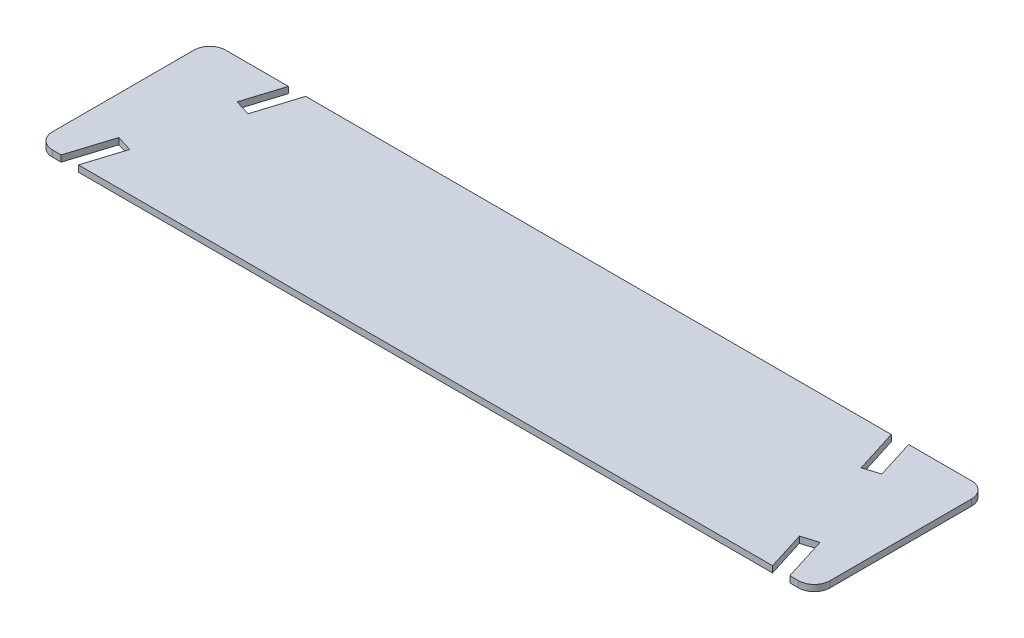
ISO-10303-21;
HEADER;
FILE_DESCRIPTION(('STEP AP214'),'2;1');
FILE_NAME('part.step','',(''),(''),'','','');
FILE_SCHEMA(('AUTOMOTIVE_DESIGN { 1 0 10303 214 1 1 1 1 }'));
ENDSEC;
DATA;
#1=APPLICATION_CONTEXT('core data for automotive mechanical design processes');
#2=APPLICATION_PROTOCOL_DEFINITION('international standard','automotive_design',2000,#1);
#3=PRODUCT_CONTEXT('',#1,'mechanical');
#4=PRODUCT('Part','Part','',(#3));
#5=PRODUCT_RELATED_PRODUCT_CATEGORY('part','',(#4));
#6=PRODUCT_DEFINITION_FORMATION('','',#4);
#7=PRODUCT_DEFINITION_CONTEXT('part definition',#1,'design');
#8=PRODUCT_DEFINITION('design','',#6,#7);
#9=PRODUCT_DEFINITION_SHAPE('','',#8);
#10=(LENGTH_UNIT() NAMED_UNIT(*) SI_UNIT(.MILLI.,.METRE.));
#11=(NAMED_UNIT(*) PLANE_ANGLE_UNIT() SI_UNIT($,.RADIAN.));
#12=(NAMED_UNIT(*) SI_UNIT($,.STERADIAN.) SOLID_ANGLE_UNIT());
#13=UNCERTAINTY_MEASURE_WITH_UNIT(LENGTH_MEASURE(1.E-05),#10,'distance_accuracy_value','');
#14=(GEOMETRIC_REPRESENTATION_CONTEXT(3) GLOBAL_UNCERTAINTY_ASSIGNED_CONTEXT((#13)) GLOBAL_UNIT_ASSIGNED_CONTEXT((#10,
#11,#12)) REPRESENTATION_CONTEXT('',''));
#15=CARTESIAN_POINT('',(0.,0.,0.));
#16=DIRECTION('',(0.,0.,1.));
#17=DIRECTION('',(1.,0.,0.));
#18=AXIS2_PLACEMENT_3D('',#15,#16,#17);
#19=CARTESIAN_POINT('',(233.90979776498,2.,0.));
#20=DIRECTION('',(-0.954146487599236,0.,0.299340074500628));
#21=DIRECTION('',(0.299340074500628,0.,0.954146487599236));
#22=AXIS2_PLACEMENT_3D('',#19,#20,#21);
#23=PLANE('',#22);
#24=DIRECTION('',(-0.299340074500628,0.,-0.954146487599236));
#25=VECTOR('',#24,1.);
#26=CARTESIAN_POINT('',(233.90979776498,0.,0.));
#27=LINE('',#26,#25);
#28=CARTESIAN_POINT('',(233.90979776498,0.,0.));
#29=VERTEX_POINT('',#28);
#30=CARTESIAN_POINT('',(230.018963258697,0.,-12.4020349904474));
#31=VERTEX_POINT('',#30);
#32=EDGE_CURVE('E225',#29,#31,#27,.T.);
#33=ORIENTED_EDGE('',*,*,#32,.T.);
#34=DIRECTION('',(0.,-1.,0.));
#35=VECTOR('',#34,1.);
#36=CARTESIAN_POINT('',(230.018963258697,2.,-12.4020349904474));
#37=LINE('',#36,#35);
#38=CARTESIAN_POINT('',(230.018963258697,2.,-12.4020349904474));
#39=VERTEX_POINT('',#38);
#40=EDGE_CURVE('E11',#39,#31,#37,.T.);
#41=ORIENTED_EDGE('',*,*,#40,.F.);
#42=DIRECTION('',(-0.299340074500628,0.,-0.954146487599236));
#43=VECTOR('',#42,1.);
#44=CARTESIAN_POINT('',(233.90979776498,2.,0.));
#45=LINE('',#44,#43);
#46=CARTESIAN_POINT('',(233.90979776498,2.,0.));
#47=VERTEX_POINT('',#46);
#48=EDGE_CURVE('E271',#47,#39,#45,.T.);
#49=ORIENTED_EDGE('',*,*,#48,.F.);
#50=DIRECTION('',(0.,-1.,0.));
#51=VECTOR('',#50,1.);
#52=CARTESIAN_POINT('',(233.90979776498,2.,0.));
#53=LINE('',#52,#51);
#54=EDGE_CURVE('E221',#47,#29,#53,.T.);
#55=ORIENTED_EDGE('',*,*,#54,.T.);
#56=EDGE_LOOP('',(#33,#41,#49,#55));
#57=FACE_BOUND('',#56,.T.);
#58=ADVANCED_FACE('F33',(#57),#23,.F.);
#59=CARTESIAN_POINT('',(230.018963258697,2.,-12.4020349904474));
#60=DIRECTION('',(-0.299340074500642,0.,-0.954146487599231));
#61=DIRECTION('',(-0.954146487599231,0.,0.299340074500642));
#62=AXIS2_PLACEMENT_3D('',#59,#60,#61);
#63=PLANE('',#62);
#64=DIRECTION('',(0.954146487599231,0.,-0.299340074500642));
#65=VECTOR('',#64,1.);
#66=CARTESIAN_POINT('',(230.018963258697,0.,-12.4020349904474));
#67=LINE('',#66,#65);
#68=CARTESIAN_POINT('',(235.028232318593,0.,-13.9735703815757));
#69=VERTEX_POINT('',#68);
#70=EDGE_CURVE('E228',#31,#69,#67,.T.);
#71=ORIENTED_EDGE('',*,*,#70,.T.);
#72=DIRECTION('',(0.,-1.,0.));
#73=VECTOR('',#72,1.);
#74=CARTESIAN_POINT('',(235.028232318593,2.,-13.9735703815757));
#75=LINE('',#74,#73);
#76=CARTESIAN_POINT('',(235.028232318593,2.,-13.9735703815757));
#77=VERTEX_POINT('',#76);
#78=EDGE_CURVE('E41',#77,#69,#75,.T.);
#79=ORIENTED_EDGE('',*,*,#78,.F.);
#80=DIRECTION('',(0.954146487599231,0.,-0.299340074500642));
#81=VECTOR('',#80,1.);
#82=CARTESIAN_POINT('',(230.018963258697,2.,-12.4020349904474));
#83=LINE('',#82,#81);
#84=EDGE_CURVE('E140',#39,#77,#83,.T.);
#85=ORIENTED_EDGE('',*,*,#84,.F.);
#86=ORIENTED_EDGE('',*,*,#40,.T.);
#87=EDGE_LOOP('',(#71,#79,#85,#86));
#88=FACE_BOUND('',#87,.T.);
#89=ADVANCED_FACE('F409',(#88),#63,.F.);
#90=CARTESIAN_POINT('',(235.028232318593,2.,-13.9735703815757));
#91=DIRECTION('',(0.954146487599231,0.,-0.299340074500643));
#92=DIRECTION('',(-0.299340074500643,0.,-0.954146487599231));
#93=AXIS2_PLACEMENT_3D('',#90,#91,#92);
#94=PLANE('',#93);
#95=DIRECTION('',(0.299340074500643,0.,0.954146487599231));
#96=VECTOR('',#95,1.);
#97=CARTESIAN_POINT('',(235.028232318593,0.,-13.9735703815757));
#98=LINE('',#97,#96);
#99=CARTESIAN_POINT('',(239.412097535752,0.,0.));
#100=VERTEX_POINT('',#99);
#101=EDGE_CURVE('E230',#69,#100,#98,.T.);
#102=ORIENTED_EDGE('',*,*,#101,.T.);
#103=DIRECTION('',(0.,-1.,0.));
#104=VECTOR('',#103,1.);
#105=CARTESIAN_POINT('',(239.412097535752,2.,0.));
#106=LINE('',#105,#104);
#107=CARTESIAN_POINT('',(239.412097535752,2.,0.));
#108=VERTEX_POINT('',#107);
#109=EDGE_CURVE('E326',#108,#100,#106,.T.);
#110=ORIENTED_EDGE('',*,*,#109,.F.);
#111=DIRECTION('',(0.299340074500643,0.,0.954146487599231));
#112=VECTOR('',#111,1.);
#113=CARTESIAN_POINT('',(235.028232318593,2.,-13.9735703815757));
#114=LINE('',#113,#112);
#115=EDGE_CURVE('E334',#77,#108,#114,.T.);
#116=ORIENTED_EDGE('',*,*,#115,.F.);
#117=ORIENTED_EDGE('',*,*,#78,.T.);
#118=EDGE_LOOP('',(#102,#110,#116,#117));
#119=FACE_BOUND('',#118,.T.);
#120=ADVANCED_FACE('F332',(#119),#94,.F.);
#121=CARTESIAN_POINT('',(239.412097535752,2.,0.));
#122=DIRECTION('',(0.,0.,-1.));
#123=DIRECTION('',(-1.,0.,0.));
#124=AXIS2_PLACEMENT_3D('',#121,#122,#123);
#125=PLANE('',#124);
#126=DIRECTION('',(1.,0.,0.));
#127=VECTOR('',#126,1.);
#128=CARTESIAN_POINT('',(239.412097535752,0.,0.));
#129=LINE('',#128,#127);
#130=CARTESIAN_POINT('',(242.157195577291,0.,0.));
#131=VERTEX_POINT('',#130);
#132=EDGE_CURVE('E232',#100,#131,#129,.T.);
#133=ORIENTED_EDGE('',*,*,#132,.T.);
#134=DIRECTION('',(0.,-1.,0.));
#135=VECTOR('',#134,1.);
#136=CARTESIAN_POINT('',(242.157195577291,2.,0.));
#137=LINE('',#136,#135);
#138=CARTESIAN_POINT('',(242.157195577291,2.,0.));
#139=VERTEX_POINT('',#138);
#140=EDGE_CURVE('E323',#139,#131,#137,.T.);
#141=ORIENTED_EDGE('',*,*,#140,.F.);
#142=DIRECTION('',(1.,0.,0.));
#143=VECTOR('',#142,1.);
#144=CARTESIAN_POINT('',(239.412097535752,2.,0.));
#145=LINE('',#144,#143);
#146=EDGE_CURVE('E352',#108,#139,#145,.T.);
#147=ORIENTED_EDGE('',*,*,#146,.F.);
#148=ORIENTED_EDGE('',*,*,#109,.T.);
#149=EDGE_LOOP('',(#133,#141,#147,#148));
#150=FACE_BOUND('',#149,.T.);
#151=ADVANCED_FACE('F343',(#150),#125,.F.);
#152=CARTESIAN_POINT('',(242.157195577291,2.,-5.));
#153=DIRECTION('',(0.,-1.,0.));
#154=DIRECTION('',(0.,0.,-1.));
#155=AXIS2_PLACEMENT_3D('',#152,#153,#154);
#156=CYLINDRICAL_SURFACE('',#155,5.);
#157=CARTESIAN_POINT('',(242.157195577291,0.,-5.));
#158=DIRECTION('',(0.,1.,0.));
#159=DIRECTION('',(0.,0.,1.));
#160=AXIS2_PLACEMENT_3D('',#157,#158,#159);
#161=CIRCLE('',#160,5.);
#162=CARTESIAN_POINT('',(247.157195577291,0.,-5.));
#163=VERTEX_POINT('',#162);
#164=EDGE_CURVE('E234',#131,#163,#161,.T.);
#165=ORIENTED_EDGE('',*,*,#164,.T.);
#166=DIRECTION('',(0.,-1.,0.));
#167=VECTOR('',#166,1.);
#168=CARTESIAN_POINT('',(247.157195577291,2.,-5.));
#169=LINE('',#168,#167);
#170=CARTESIAN_POINT('',(247.157195577291,2.,-5.));
#171=VERTEX_POINT('',#170);
#172=EDGE_CURVE('E320',#171,#163,#169,.T.);
#173=ORIENTED_EDGE('',*,*,#172,.F.);
#174=CARTESIAN_POINT('',(242.157195577291,2.,-5.));
#175=DIRECTION('',(0.,1.,0.));
#176=DIRECTION('',(0.,0.,1.));
#177=AXIS2_PLACEMENT_3D('',#174,#175,#176);
#178=CIRCLE('',#177,5.);
#179=EDGE_CURVE('E349',#139,#171,#178,.T.);
#180=ORIENTED_EDGE('',*,*,#179,.F.);
#181=ORIENTED_EDGE('',*,*,#140,.T.);
#182=EDGE_LOOP('',(#165,#173,#180,#181));
#183=FACE_BOUND('',#182,.T.);
#184=ADVANCED_FACE('F347',(#183),#156,.T.);
#185=CARTESIAN_POINT('',(247.157195577291,2.,-5.));
#186=DIRECTION('',(-1.,0.,0.));
#187=DIRECTION('',(0.,0.,1.));
#188=AXIS2_PLACEMENT_3D('',#185,#186,#187);
#189=PLANE('',#188);
#190=DIRECTION('',(0.,0.,-1.));
#191=VECTOR('',#190,1.);
#192=CARTESIAN_POINT('',(247.157195577291,0.,-5.));
#193=LINE('',#192,#191);
#194=CARTESIAN_POINT('',(247.157195577291,0.,-50.));
#195=VERTEX_POINT('',#194);
#196=EDGE_CURVE('E236',#163,#195,#193,.T.);
#197=ORIENTED_EDGE('',*,*,#196,.T.);
#198=DIRECTION('',(0.,-1.,0.));
#199=VECTOR('',#198,1.);
#200=CARTESIAN_POINT('',(247.157195577291,2.,-50.));
#201=LINE('',#200,#199);
#202=CARTESIAN_POINT('',(247.157195577291,2.,-50.));
#203=VERTEX_POINT('',#202);
#204=EDGE_CURVE('E317',#203,#195,#201,.T.);
#205=ORIENTED_EDGE('',*,*,#204,.F.);
#206=DIRECTION('',(0.,0.,-1.));
#207=VECTOR('',#206,1.);
#208=CARTESIAN_POINT('',(247.157195577291,2.,-5.));
#209=LINE('',#208,#207);
#210=EDGE_CURVE('E351',#171,#203,#209,.T.);
#211=ORIENTED_EDGE('',*,*,#210,.F.);
#212=ORIENTED_EDGE('',*,*,#172,.T.);
#213=EDGE_LOOP('',(#197,#205,#211,#212));
#214=FACE_BOUND('',#213,.T.);
#215=ADVANCED_FACE('F422',(#214),#189,.F.);
#216=CARTESIAN_POINT('',(242.157195577291,2.,-50.));
#217=DIRECTION('',(0.,-1.,0.));
#218=DIRECTION('',(0.,0.,-1.));
#219=AXIS2_PLACEMENT_3D('',#216,#217,#218);
#220=CYLINDRICAL_SURFACE('',#219,5.);
#221=CARTESIAN_POINT('',(242.157195577291,0.,-50.));
#222=DIRECTION('',(0.,1.,0.));
#223=DIRECTION('',(0.,0.,1.));
#224=AXIS2_PLACEMENT_3D('',#221,#222,#223);
#225=CIRCLE('',#224,5.);
#226=CARTESIAN_POINT('',(242.157195577291,0.,-55.));
#227=VERTEX_POINT('',#226);
#228=EDGE_CURVE('E238',#195,#227,#225,.T.);
#229=ORIENTED_EDGE('',*,*,#228,.T.);
#230=DIRECTION('',(0.,-1.,0.));
#231=VECTOR('',#230,1.);
#232=CARTESIAN_POINT('',(242.157195577291,2.,-55.));
#233=LINE('',#232,#231);
#234=CARTESIAN_POINT('',(242.157195577291,2.,-55.));
#235=VERTEX_POINT('',#234);
#236=EDGE_CURVE('E314',#235,#227,#233,.T.);
#237=ORIENTED_EDGE('',*,*,#236,.F.);
#238=CARTESIAN_POINT('',(242.157195577291,2.,-50.));
#239=DIRECTION('',(0.,1.,0.));
#240=DIRECTION('',(0.,0.,1.));
#241=AXIS2_PLACEMENT_3D('',#238,#239,#240);
#242=CIRCLE('',#241,5.);
#243=EDGE_CURVE('E354',#203,#235,#242,.T.);
#244=ORIENTED_EDGE('',*,*,#243,.F.);
#245=ORIENTED_EDGE('',*,*,#204,.T.);
#246=EDGE_LOOP('',(#229,#237,#244,#245));
#247=FACE_BOUND('',#246,.T.);
#248=ADVANCED_FACE('F425',(#247),#220,.T.);
#249=CARTESIAN_POINT('',(242.157195577291,2.,-55.));
#250=DIRECTION('',(0.,0.,1.));
#251=DIRECTION('',(1.,0.,0.));
#252=AXIS2_PLACEMENT_3D('',#249,#250,#251);
#253=PLANE('',#252);
#254=DIRECTION('',(-1.,0.,0.));
#255=VECTOR('',#254,1.);
#256=CARTESIAN_POINT('',(242.157195577291,0.,-55.));
#257=LINE('',#256,#255);
#258=CARTESIAN_POINT('',(222.157195577291,0.,-55.));
#259=VERTEX_POINT('',#258);
#260=EDGE_CURVE('E240',#227,#259,#257,.T.);
#261=ORIENTED_EDGE('',*,*,#260,.T.);
#262=DIRECTION('',(0.,-1.,0.));
#263=VECTOR('',#262,1.);
#264=CARTESIAN_POINT('',(222.157195577291,2.,-55.));
#265=LINE('',#264,#263);
#266=CARTESIAN_POINT('',(222.157195577291,2.,-55.));
#267=VERTEX_POINT('',#266);
#268=EDGE_CURVE('E311',#267,#259,#265,.T.);
#269=ORIENTED_EDGE('',*,*,#268,.F.);
#270=DIRECTION('',(-1.,0.,0.));
#271=VECTOR('',#270,1.);
#272=CARTESIAN_POINT('',(242.157195577291,2.,-55.));
#273=LINE('',#272,#271);
#274=EDGE_CURVE('E360',#235,#267,#273,.T.);
#275=ORIENTED_EDGE('',*,*,#274,.F.);
#276=ORIENTED_EDGE('',*,*,#236,.T.);
#277=EDGE_LOOP('',(#261,#269,#275,#276));
#278=FACE_BOUND('',#277,.T.);
#279=ADVANCED_FACE('F429',(#278),#253,.F.);
#280=CARTESIAN_POINT('',(222.157195577291,2.,-55.));
#281=DIRECTION('',(0.954146487599232,0.,-0.29934007450064));
#282=DIRECTION('',(-0.29934007450064,0.,-0.954146487599232));
#283=AXIS2_PLACEMENT_3D('',#280,#281,#282);
#284=PLANE('',#283);
#285=DIRECTION('',(0.29934007450064,0.,0.954146487599232));
#286=VECTOR('',#285,1.);
#287=CARTESIAN_POINT('',(222.157195577291,0.,-55.));
#288=LINE('',#287,#286);
#289=CARTESIAN_POINT('',(226.048030083574,0.,-42.5979650095527));
#290=VERTEX_POINT('',#289);
#291=EDGE_CURVE('E242',#259,#290,#288,.T.);
#292=ORIENTED_EDGE('',*,*,#291,.T.);
#293=DIRECTION('',(0.,-1.,0.));
#294=VECTOR('',#293,1.);
#295=CARTESIAN_POINT('',(226.048030083574,2.,-42.5979650095527));
#296=LINE('',#295,#294);
#297=CARTESIAN_POINT('',(226.048030083574,2.,-42.5979650095527));
#298=VERTEX_POINT('',#297);
#299=EDGE_CURVE('E308',#298,#290,#296,.T.);
#300=ORIENTED_EDGE('',*,*,#299,.F.);
#301=DIRECTION('',(0.29934007450064,0.,0.954146487599232));
#302=VECTOR('',#301,1.);
#303=CARTESIAN_POINT('',(222.157195577291,2.,-55.));
#304=LINE('',#303,#302);
#305=EDGE_CURVE('E362',#267,#298,#304,.T.);
#306=ORIENTED_EDGE('',*,*,#305,.F.);
#307=ORIENTED_EDGE('',*,*,#268,.T.);
#308=EDGE_LOOP('',(#292,#300,#306,#307));
#309=FACE_BOUND('',#308,.T.);
#310=ADVANCED_FACE('F433',(#309),#284,.F.);
#311=CARTESIAN_POINT('',(226.048030083574,2.,-42.5979650095527));
#312=DIRECTION('',(0.299340074500642,0.,0.954146487599231));
#313=DIRECTION('',(0.954146487599231,0.,-0.299340074500642));
#314=AXIS2_PLACEMENT_3D('',#311,#312,#313);
#315=PLANE('',#314);
#316=DIRECTION('',(-0.954146487599231,0.,0.299340074500642));
#317=VECTOR('',#316,1.);
#318=CARTESIAN_POINT('',(226.048030083574,0.,-42.5979650095527));
#319=LINE('',#318,#317);
#320=CARTESIAN_POINT('',(221.038761023678,0.,-41.0264296184243));
#321=VERTEX_POINT('',#320);
#322=EDGE_CURVE('E244',#290,#321,#319,.T.);
#323=ORIENTED_EDGE('',*,*,#322,.T.);
#324=DIRECTION('',(0.,-1.,0.));
#325=VECTOR('',#324,1.);
#326=CARTESIAN_POINT('',(221.038761023678,2.,-41.0264296184243));
#327=LINE('',#326,#325);
#328=CARTESIAN_POINT('',(221.038761023678,2.,-41.0264296184243));
#329=VERTEX_POINT('',#328);
#330=EDGE_CURVE('E305',#329,#321,#327,.T.);
#331=ORIENTED_EDGE('',*,*,#330,.F.);
#332=DIRECTION('',(-0.954146487599231,0.,0.299340074500642));
#333=VECTOR('',#332,1.);
#334=CARTESIAN_POINT('',(226.048030083574,2.,-42.5979650095527));
#335=LINE('',#334,#333);
#336=EDGE_CURVE('E364',#298,#329,#335,.T.);
#337=ORIENTED_EDGE('',*,*,#336,.F.);
#338=ORIENTED_EDGE('',*,*,#299,.T.);
#339=EDGE_LOOP('',(#323,#331,#337,#338));
#340=FACE_BOUND('',#339,.T.);
#341=ADVANCED_FACE('F437',(#340),#315,.F.);
#342=CARTESIAN_POINT('',(221.038761023678,2.,-41.0264296184243));
#343=DIRECTION('',(-0.954146487599229,0.,0.29934007450065));
#344=DIRECTION('',(0.29934007450065,0.,0.954146487599229));
#345=AXIS2_PLACEMENT_3D('',#342,#343,#344);
#346=PLANE('',#345);
#347=DIRECTION('',(-0.29934007450065,0.,-0.954146487599229));
#348=VECTOR('',#347,1.);
#349=CARTESIAN_POINT('',(221.038761023678,0.,-41.0264296184243));
#350=LINE('',#349,#348);
#351=CARTESIAN_POINT('',(216.654895806519,0.,-55.));
#352=VERTEX_POINT('',#351);
#353=EDGE_CURVE('E246',#321,#352,#350,.T.);
#354=ORIENTED_EDGE('',*,*,#353,.T.);
#355=DIRECTION('',(0.,-1.,0.));
#356=VECTOR('',#355,1.);
#357=CARTESIAN_POINT('',(216.654895806519,2.,-55.));
#358=LINE('',#357,#356);
#359=CARTESIAN_POINT('',(216.654895806519,2.,-55.));
#360=VERTEX_POINT('',#359);
#361=EDGE_CURVE('E302',#360,#352,#358,.T.);
#362=ORIENTED_EDGE('',*,*,#361,.F.);
#363=DIRECTION('',(-0.29934007450065,0.,-0.954146487599229));
#364=VECTOR('',#363,1.);
#365=CARTESIAN_POINT('',(221.038761023678,2.,-41.0264296184243));
#366=LINE('',#365,#364);
#367=EDGE_CURVE('E366',#329,#360,#366,.T.);
#368=ORIENTED_EDGE('',*,*,#367,.F.);
#369=ORIENTED_EDGE('',*,*,#330,.T.);
#370=EDGE_LOOP('',(#354,#362,#368,#369));
#371=FACE_BOUND('',#370,.T.);
#372=ADVANCED_FACE('F441',(#371),#346,.F.);
#373=CARTESIAN_POINT('',(216.654895806519,2.,-55.));
#374=DIRECTION('',(0.,0.,1.));
#375=DIRECTION('',(1.,0.,0.));
#376=AXIS2_PLACEMENT_3D('',#373,#374,#375);
#377=PLANE('',#376);
#378=DIRECTION('',(-1.,0.,0.));
#379=VECTOR('',#378,1.);
#380=CARTESIAN_POINT('',(216.654895806519,0.,-55.));
#381=LINE('',#380,#379);
#382=CARTESIAN_POINT('',(30.5022997707716,0.,-55.));
#383=VERTEX_POINT('',#382);
#384=EDGE_CURVE('E248',#352,#383,#381,.T.);
#385=ORIENTED_EDGE('',*,*,#384,.T.);
#386=DIRECTION('',(0.,-1.,0.));
#387=VECTOR('',#386,1.);
#388=CARTESIAN_POINT('',(30.5022997707716,2.,-55.));
#389=LINE('',#388,#387);
#390=CARTESIAN_POINT('',(30.5022997707716,2.,-55.));
#391=VERTEX_POINT('',#390);
#392=EDGE_CURVE('E299',#391,#383,#389,.T.);
#393=ORIENTED_EDGE('',*,*,#392,.F.);
#394=DIRECTION('',(-1.,0.,0.));
#395=VECTOR('',#394,1.);
#396=CARTESIAN_POINT('',(216.654895806519,2.,-55.));
#397=LINE('',#396,#395);
#398=EDGE_CURVE('E368',#360,#391,#397,.T.);
#399=ORIENTED_EDGE('',*,*,#398,.F.);
#400=ORIENTED_EDGE('',*,*,#361,.T.);
#401=EDGE_LOOP('',(#385,#393,#399,#400));
#402=FACE_BOUND('',#401,.T.);
#403=ADVANCED_FACE('F445',(#402),#377,.F.);
#404=CARTESIAN_POINT('',(30.5022997707716,2.,-55.));
#405=DIRECTION('',(0.954146487599235,0.,0.299340074500629));
#406=DIRECTION('',(0.299340074500629,0.,-0.954146487599235));
#407=AXIS2_PLACEMENT_3D('',#404,#405,#406);
#408=PLANE('',#407);
#409=DIRECTION('',(-0.299340074500629,0.,0.954146487599235));
#410=VECTOR('',#409,1.);
#411=CARTESIAN_POINT('',(30.5022997707716,0.,-55.));
#412=LINE('',#411,#410);
#413=CARTESIAN_POINT('',(26.1184345536126,0.,-41.0264296184243));
#414=VERTEX_POINT('',#413);
#415=EDGE_CURVE('E250',#383,#414,#412,.T.);
#416=ORIENTED_EDGE('',*,*,#415,.T.);
#417=DIRECTION('',(0.,-1.,0.));
#418=VECTOR('',#417,1.);
#419=CARTESIAN_POINT('',(26.1184345536126,2.,-41.0264296184243));
#420=LINE('',#419,#418);
#421=CARTESIAN_POINT('',(26.1184345536126,2.,-41.0264296184243));
#422=VERTEX_POINT('',#421);
#423=EDGE_CURVE('E296',#422,#414,#420,.T.);
#424=ORIENTED_EDGE('',*,*,#423,.F.);
#425=DIRECTION('',(-0.299340074500629,0.,0.954146487599235));
#426=VECTOR('',#425,1.);
#427=CARTESIAN_POINT('',(30.5022997707716,2.,-55.));
#428=LINE('',#427,#426);
#429=EDGE_CURVE('E370',#391,#422,#428,.T.);
#430=ORIENTED_EDGE('',*,*,#429,.F.);
#431=ORIENTED_EDGE('',*,*,#392,.T.);
#432=EDGE_LOOP('',(#416,#424,#430,#431));
#433=FACE_BOUND('',#432,.T.);
#434=ADVANCED_FACE('F449',(#433),#408,.F.);
#435=CARTESIAN_POINT('',(21.1091654937167,2.,-42.5979650095527));
#436=DIRECTION('',(-0.299340074500642,0.,0.954146487599231));
#437=DIRECTION('',(0.954146487599231,0.,0.299340074500642));
#438=AXIS2_PLACEMENT_3D('',#435,#436,#437);
#439=PLANE('',#438);
#440=DIRECTION('',(-0.954146487599231,0.,-0.299340074500642));
#441=VECTOR('',#440,1.);
#442=CARTESIAN_POINT('',(21.1091654937167,0.,-42.5979650095527));
#443=LINE('',#442,#441);
#444=CARTESIAN_POINT('',(21.1091654937167,0.,-42.5979650095527));
#445=VERTEX_POINT('',#444);
#446=EDGE_CURVE('E252',#414,#445,#443,.T.);
#447=ORIENTED_EDGE('',*,*,#446,.T.);
#448=DIRECTION('',(0.,-1.,0.));
#449=VECTOR('',#448,1.);
#450=CARTESIAN_POINT('',(21.1091654937167,2.,-42.5979650095527));
#451=LINE('',#450,#449);
#452=CARTESIAN_POINT('',(21.1091654937167,2.,-42.5979650095527));
#453=VERTEX_POINT('',#452);
#454=EDGE_CURVE('E293',#453,#445,#451,.T.);
#455=ORIENTED_EDGE('',*,*,#454,.F.);
#456=DIRECTION('',(-0.954146487599231,0.,-0.299340074500642));
#457=VECTOR('',#456,1.);
#458=CARTESIAN_POINT('',(21.1091654937167,2.,-42.5979650095527));
#459=LINE('',#458,#457);
#460=EDGE_CURVE('E372',#422,#453,#459,.T.);
#461=ORIENTED_EDGE('',*,*,#460,.F.);
#462=ORIENTED_EDGE('',*,*,#423,.T.);
#463=EDGE_LOOP('',(#447,#455,#461,#462));
#464=FACE_BOUND('',#463,.T.);
#465=ADVANCED_FACE('F453',(#464),#439,.F.);
#466=CARTESIAN_POINT('',(24.9999999999999,2.,-55.));
#467=DIRECTION('',(-0.954146487599232,0.,-0.299340074500641));
#468=DIRECTION('',(-0.299340074500641,0.,0.954146487599232));
#469=AXIS2_PLACEMENT_3D('',#466,#467,#468);
#470=PLANE('',#469);
#471=DIRECTION('',(0.299340074500641,0.,-0.954146487599232));
#472=VECTOR('',#471,1.);
#473=CARTESIAN_POINT('',(24.9999999999999,0.,-55.));
#474=LINE('',#473,#472);
#475=CARTESIAN_POINT('',(24.9999999999999,0.,-55.));
#476=VERTEX_POINT('',#475);
#477=EDGE_CURVE('E254',#445,#476,#474,.T.);
#478=ORIENTED_EDGE('',*,*,#477,.T.);
#479=DIRECTION('',(0.,-1.,0.));
#480=VECTOR('',#479,1.);
#481=CARTESIAN_POINT('',(24.9999999999999,2.,-55.));
#482=LINE('',#481,#480);
#483=CARTESIAN_POINT('',(24.9999999999999,2.,-55.));
#484=VERTEX_POINT('',#483);
#485=EDGE_CURVE('E290',#484,#476,#482,.T.);
#486=ORIENTED_EDGE('',*,*,#485,.F.);
#487=DIRECTION('',(0.299340074500641,0.,-0.954146487599232));
#488=VECTOR('',#487,1.);
#489=CARTESIAN_POINT('',(24.9999999999999,2.,-55.));
#490=LINE('',#489,#488);
#491=EDGE_CURVE('E374',#453,#484,#490,.T.);
#492=ORIENTED_EDGE('',*,*,#491,.F.);
#493=ORIENTED_EDGE('',*,*,#454,.T.);
#494=EDGE_LOOP('',(#478,#486,#492,#493));
#495=FACE_BOUND('',#494,.T.);
#496=ADVANCED_FACE('F457',(#495),#470,.F.);
#497=CARTESIAN_POINT('',(4.99999999999995,2.,-55.));
#498=DIRECTION('',(0.,0.,1.));
#499=DIRECTION('',(1.,0.,0.));
#500=AXIS2_PLACEMENT_3D('',#497,#498,#499);
#501=PLANE('',#500);
#502=DIRECTION('',(-1.,0.,0.));
#503=VECTOR('',#502,1.);
#504=CARTESIAN_POINT('',(4.99999999999995,0.,-55.));
#505=LINE('',#504,#503);
#506=CARTESIAN_POINT('',(4.99999999999995,0.,-55.));
#507=VERTEX_POINT('',#506);
#508=EDGE_CURVE('E256',#476,#507,#505,.T.);
#509=ORIENTED_EDGE('',*,*,#508,.T.);
#510=DIRECTION('',(0.,-1.,0.));
#511=VECTOR('',#510,1.);
#512=CARTESIAN_POINT('',(4.99999999999995,2.,-55.));
#513=LINE('',#512,#511);
#514=CARTESIAN_POINT('',(4.99999999999995,2.,-55.));
#515=VERTEX_POINT('',#514);
#516=EDGE_CURVE('E287',#515,#507,#513,.T.);
#517=ORIENTED_EDGE('',*,*,#516,.F.);
#518=DIRECTION('',(-1.,0.,0.));
#519=VECTOR('',#518,1.);
#520=CARTESIAN_POINT('',(4.99999999999995,2.,-55.));
#521=LINE('',#520,#519);
#522=EDGE_CURVE('E376',#484,#515,#521,.T.);
#523=ORIENTED_EDGE('',*,*,#522,.F.);
#524=ORIENTED_EDGE('',*,*,#485,.T.);
#525=EDGE_LOOP('',(#509,#517,#523,#524));
#526=FACE_BOUND('',#525,.T.);
#527=ADVANCED_FACE('F461',(#526),#501,.F.);
#528=CARTESIAN_POINT('',(4.99999999999999,2.,-50.));
#529=DIRECTION('',(0.,-1.,0.));
#530=DIRECTION('',(0.,0.,-1.));
#531=AXIS2_PLACEMENT_3D('',#528,#529,#530);
#532=CYLINDRICAL_SURFACE('',#531,4.99999999999999);
#533=CARTESIAN_POINT('',(4.99999999999999,0.,-50.));
#534=DIRECTION('',(0.,1.,0.));
#535=DIRECTION('',(0.,0.,-1.));
#536=AXIS2_PLACEMENT_3D('',#533,#534,#535);
#537=CIRCLE('',#536,4.99999999999999);
#538=CARTESIAN_POINT('',(0.,0.,-50.));
#539=VERTEX_POINT('',#538);
#540=EDGE_CURVE('E258',#507,#539,#537,.T.);
#541=ORIENTED_EDGE('',*,*,#540,.T.);
#542=DIRECTION('',(0.,-1.,0.));
#543=VECTOR('',#542,1.);
#544=CARTESIAN_POINT('',(0.,2.,-50.));
#545=LINE('',#544,#543);
#546=CARTESIAN_POINT('',(0.,2.,-50.));
#547=VERTEX_POINT('',#546);
#548=EDGE_CURVE('E284',#547,#539,#545,.T.);
#549=ORIENTED_EDGE('',*,*,#548,.F.);
#550=CARTESIAN_POINT('',(4.99999999999999,2.,-50.));
#551=DIRECTION('',(0.,1.,0.));
#552=DIRECTION('',(0.,0.,-1.));
#553=AXIS2_PLACEMENT_3D('',#550,#551,#552);
#554=CIRCLE('',#553,4.99999999999999);
#555=EDGE_CURVE('E378',#515,#547,#554,.T.);
#556=ORIENTED_EDGE('',*,*,#555,.F.);
#557=ORIENTED_EDGE('',*,*,#516,.T.);
#558=EDGE_LOOP('',(#541,#549,#556,#557));
#559=FACE_BOUND('',#558,.T.);
#560=ADVANCED_FACE('F465',(#559),#532,.T.);
#561=CARTESIAN_POINT('',(0.,2.,-5.00000000000004));
#562=DIRECTION('',(1.,0.,0.));
#563=DIRECTION('',(0.,0.,-1.));
#564=AXIS2_PLACEMENT_3D('',#561,#562,#563);
#565=PLANE('',#564);
#566=DIRECTION('',(0.,0.,1.));
#567=VECTOR('',#566,1.);
#568=CARTESIAN_POINT('',(0.,0.,-5.00000000000004));
#569=LINE('',#568,#567);
#570=CARTESIAN_POINT('',(0.,0.,-5.00000000000003));
#571=VERTEX_POINT('',#570);
#572=EDGE_CURVE('E260',#539,#571,#569,.T.);
#573=ORIENTED_EDGE('',*,*,#572,.T.);
#574=DIRECTION('',(0.,-1.,0.));
#575=VECTOR('',#574,1.);
#576=CARTESIAN_POINT('',(0.,2.,-5.00000000000003));
#577=LINE('',#576,#575);
#578=CARTESIAN_POINT('',(0.,2.,-5.00000000000003));
#579=VERTEX_POINT('',#578);
#580=EDGE_CURVE('E281',#579,#571,#577,.T.);
#581=ORIENTED_EDGE('',*,*,#580,.F.);
#582=DIRECTION('',(0.,0.,1.));
#583=VECTOR('',#582,1.);
#584=CARTESIAN_POINT('',(0.,2.,-5.00000000000004));
#585=LINE('',#584,#583);
#586=EDGE_CURVE('E380',#547,#579,#585,.T.);
#587=ORIENTED_EDGE('',*,*,#586,.F.);
#588=ORIENTED_EDGE('',*,*,#548,.T.);
#589=EDGE_LOOP('',(#573,#581,#587,#588));
#590=FACE_BOUND('',#589,.T.);
#591=ADVANCED_FACE('F469',(#590),#565,.F.);
#592=CARTESIAN_POINT('',(5.,2.,-5.));
#593=DIRECTION('',(0.,-1.,0.));
#594=DIRECTION('',(0.,0.,-1.));
#595=AXIS2_PLACEMENT_3D('',#592,#593,#594);
#596=CYLINDRICAL_SURFACE('',#595,5.);
#597=CARTESIAN_POINT('',(5.,0.,-5.));
#598=DIRECTION('',(0.,1.,0.));
#599=DIRECTION('',(0.,0.,-1.));
#600=AXIS2_PLACEMENT_3D('',#597,#598,#599);
#601=CIRCLE('',#600,5.);
#602=CARTESIAN_POINT('',(5.00000000000004,0.,0.));
#603=VERTEX_POINT('',#602);
#604=EDGE_CURVE('E262',#571,#603,#601,.T.);
#605=ORIENTED_EDGE('',*,*,#604,.T.);
#606=DIRECTION('',(0.,-1.,0.));
#607=VECTOR('',#606,1.);
#608=CARTESIAN_POINT('',(5.00000000000004,2.,0.));
#609=LINE('',#608,#607);
#610=CARTESIAN_POINT('',(5.00000000000004,2.,0.));
#611=VERTEX_POINT('',#610);
#612=EDGE_CURVE('E278',#611,#603,#609,.T.);
#613=ORIENTED_EDGE('',*,*,#612,.F.);
#614=CARTESIAN_POINT('',(5.,2.,-5.));
#615=DIRECTION('',(0.,1.,0.));
#616=DIRECTION('',(0.,0.,-1.));
#617=AXIS2_PLACEMENT_3D('',#614,#615,#616);
#618=CIRCLE('',#617,5.);
#619=EDGE_CURVE('E382',#579,#611,#618,.T.);
#620=ORIENTED_EDGE('',*,*,#619,.F.);
#621=ORIENTED_EDGE('',*,*,#580,.T.);
#622=EDGE_LOOP('',(#605,#613,#620,#621));
#623=FACE_BOUND('',#622,.T.);
#624=ADVANCED_FACE('F473',(#623),#596,.T.);
#625=CARTESIAN_POINT('',(5.00000000000004,2.,0.));
#626=DIRECTION('',(0.,0.,-1.));
#627=DIRECTION('',(-1.,0.,0.));
#628=AXIS2_PLACEMENT_3D('',#625,#626,#627);
#629=PLANE('',#628);
#630=DIRECTION('',(1.,0.,0.));
#631=VECTOR('',#630,1.);
#632=CARTESIAN_POINT('',(5.00000000000004,0.,0.));
#633=LINE('',#632,#631);
#634=CARTESIAN_POINT('',(7.74509804153829,0.,0.));
#635=VERTEX_POINT('',#634);
#636=EDGE_CURVE('E264',#603,#635,#633,.T.);
#637=ORIENTED_EDGE('',*,*,#636,.T.);
#638=DIRECTION('',(0.,-1.,0.));
#639=VECTOR('',#638,1.);
#640=CARTESIAN_POINT('',(7.74509804153829,2.,0.));
#641=LINE('',#640,#639);
#642=CARTESIAN_POINT('',(7.74509804153829,2.,0.));
#643=VERTEX_POINT('',#642);
#644=EDGE_CURVE('E275',#643,#635,#641,.T.);
#645=ORIENTED_EDGE('',*,*,#644,.F.);
#646=DIRECTION('',(1.,0.,0.));
#647=VECTOR('',#646,1.);
#648=CARTESIAN_POINT('',(5.00000000000004,2.,0.));
#649=LINE('',#648,#647);
#650=EDGE_CURVE('E384',#611,#643,#649,.T.);
#651=ORIENTED_EDGE('',*,*,#650,.F.);
#652=ORIENTED_EDGE('',*,*,#612,.T.);
#653=EDGE_LOOP('',(#637,#645,#651,#652));
#654=FACE_BOUND('',#653,.T.);
#655=ADVANCED_FACE('F390',(#654),#629,.F.);
#656=CARTESIAN_POINT('',(7.74509804153829,2.,0.));
#657=DIRECTION('',(-0.954146487599231,0.,-0.299340074500642));
#658=DIRECTION('',(-0.299340074500642,0.,0.954146487599231));
#659=AXIS2_PLACEMENT_3D('',#656,#657,#658);
#660=PLANE('',#659);
#661=DIRECTION('',(0.299340074500642,0.,-0.954146487599231));
#662=VECTOR('',#661,1.);
#663=CARTESIAN_POINT('',(7.74509804153829,0.,0.));
#664=LINE('',#663,#662);
#665=CARTESIAN_POINT('',(12.1289632586974,0.,-13.9735703815757));
#666=VERTEX_POINT('',#665);
#667=EDGE_CURVE('E266',#635,#666,#664,.T.);
#668=ORIENTED_EDGE('',*,*,#667,.T.);
#669=DIRECTION('',(0.,-1.,0.));
#670=VECTOR('',#669,1.);
#671=CARTESIAN_POINT('',(12.1289632586974,2.,-13.9735703815757));
#672=LINE('',#671,#670);
#673=CARTESIAN_POINT('',(12.1289632586974,2.,-13.9735703815757));
#674=VERTEX_POINT('',#673);
#675=EDGE_CURVE('E216',#674,#666,#672,.T.);
#676=ORIENTED_EDGE('',*,*,#675,.F.);
#677=DIRECTION('',(0.299340074500642,0.,-0.954146487599231));
#678=VECTOR('',#677,1.);
#679=CARTESIAN_POINT('',(7.74509804153829,2.,0.));
#680=LINE('',#679,#678);
#681=EDGE_CURVE('E207',#643,#674,#680,.T.);
#682=ORIENTED_EDGE('',*,*,#681,.F.);
#683=ORIENTED_EDGE('',*,*,#644,.T.);
#684=EDGE_LOOP('',(#668,#676,#682,#683));
#685=FACE_BOUND('',#684,.T.);
#686=ADVANCED_FACE('F394',(#685),#660,.F.);
#687=CARTESIAN_POINT('',(12.1289632586974,2.,-13.9735703815757));
#688=DIRECTION('',(0.299340074500641,0.,-0.954146487599232));
#689=DIRECTION('',(-0.954146487599232,0.,-0.299340074500641));
#690=AXIS2_PLACEMENT_3D('',#687,#688,#689);
#691=PLANE('',#690);
#692=DIRECTION('',(0.954146487599232,0.,0.299340074500641));
#693=VECTOR('',#692,1.);
#694=CARTESIAN_POINT('',(12.1289632586974,0.,-13.9735703815757));
#695=LINE('',#694,#693);
#696=CARTESIAN_POINT('',(17.1382323185934,0.,-12.4020349904474));
#697=VERTEX_POINT('',#696);
#698=EDGE_CURVE('E215',#666,#697,#695,.T.);
#699=ORIENTED_EDGE('',*,*,#698,.T.);
#700=DIRECTION('',(0.,-1.,0.));
#701=VECTOR('',#700,1.);
#702=CARTESIAN_POINT('',(17.1382323185934,2.,-12.4020349904474));
#703=LINE('',#702,#701);
#704=CARTESIAN_POINT('',(17.1382323185934,2.,-12.4020349904474));
#705=VERTEX_POINT('',#704);
#706=EDGE_CURVE('E212',#705,#697,#703,.T.);
#707=ORIENTED_EDGE('',*,*,#706,.F.);
#708=DIRECTION('',(0.954146487599232,0.,0.299340074500641));
#709=VECTOR('',#708,1.);
#710=CARTESIAN_POINT('',(12.1289632586974,2.,-13.9735703815757));
#711=LINE('',#710,#709);
#712=EDGE_CURVE('E201',#674,#705,#711,.T.);
#713=ORIENTED_EDGE('',*,*,#712,.F.);
#714=ORIENTED_EDGE('',*,*,#675,.T.);
#715=EDGE_LOOP('',(#699,#707,#713,#714));
#716=FACE_BOUND('',#715,.T.);
#717=ADVANCED_FACE('F213',(#716),#691,.F.);
#718=CARTESIAN_POINT('',(17.1382323185934,2.,-12.4020349904474));
#719=DIRECTION('',(0.954146487599226,0.,0.299340074500658));
#720=DIRECTION('',(0.299340074500658,0.,-0.954146487599226));
#721=AXIS2_PLACEMENT_3D('',#718,#719,#720);
#722=PLANE('',#721);
#723=DIRECTION('',(-0.299340074500658,0.,0.954146487599226));
#724=VECTOR('',#723,1.);
#725=CARTESIAN_POINT('',(17.1382323185934,0.,-12.4020349904474));
#726=LINE('',#725,#724);
#727=CARTESIAN_POINT('',(13.2473978123099,0.,0.));
#728=VERTEX_POINT('',#727);
#729=EDGE_CURVE('E126',#697,#728,#726,.T.);
#730=ORIENTED_EDGE('',*,*,#729,.T.);
#731=DIRECTION('',(0.,-1.,0.));
#732=VECTOR('',#731,1.);
#733=CARTESIAN_POINT('',(13.2473978123099,2.,0.));
#734=LINE('',#733,#732);
#735=CARTESIAN_POINT('',(13.2473978123099,2.,0.));
#736=VERTEX_POINT('',#735);
#737=EDGE_CURVE('E217',#736,#728,#734,.T.);
#738=ORIENTED_EDGE('',*,*,#737,.F.);
#739=DIRECTION('',(-0.299340074500658,0.,0.954146487599226));
#740=VECTOR('',#739,1.);
#741=CARTESIAN_POINT('',(17.1382323185934,2.,-12.4020349904474));
#742=LINE('',#741,#740);
#743=EDGE_CURVE('E205',#705,#736,#742,.T.);
#744=ORIENTED_EDGE('',*,*,#743,.F.);
#745=ORIENTED_EDGE('',*,*,#706,.T.);
#746=EDGE_LOOP('',(#730,#738,#744,#745));
#747=FACE_BOUND('',#746,.T.);
#748=ADVANCED_FACE('F219',(#747),#722,.F.);
#749=CARTESIAN_POINT('',(13.2473978123099,2.,0.));
#750=DIRECTION('',(0.,0.,-1.));
#751=DIRECTION('',(-1.,0.,0.));
#752=AXIS2_PLACEMENT_3D('',#749,#750,#751);
#753=PLANE('',#752);
#754=DIRECTION('',(1.,0.,0.));
#755=VECTOR('',#754,1.);
#756=CARTESIAN_POINT('',(13.2473978123099,0.,0.));
#757=LINE('',#756,#755);
#758=EDGE_CURVE('E132',#728,#29,#757,.T.);
#759=ORIENTED_EDGE('',*,*,#758,.T.);
#760=ORIENTED_EDGE('',*,*,#54,.F.);
#761=DIRECTION('',(1.,0.,0.));
#762=VECTOR('',#761,1.);
#763=CARTESIAN_POINT('',(13.2473978123099,2.,0.));
#764=LINE('',#763,#762);
#765=EDGE_CURVE('E49',#736,#47,#764,.T.);
#766=ORIENTED_EDGE('',*,*,#765,.F.);
#767=ORIENTED_EDGE('',*,*,#737,.T.);
#768=EDGE_LOOP('',(#759,#760,#766,#767));
#769=FACE_BOUND('',#768,.T.);
#770=ADVANCED_FACE('F398',(#769),#753,.F.);
#771=CARTESIAN_POINT('',(242.157195577291,2.,-5.));
#772=DIRECTION('',(0.,1.,0.));
#773=DIRECTION('',(0.,0.,1.));
#774=AXIS2_PLACEMENT_3D('',#771,#772,#773);
#775=PLANE('',#774);
#776=ORIENTED_EDGE('',*,*,#48,.T.);
#777=ORIENTED_EDGE('',*,*,#84,.T.);
#778=ORIENTED_EDGE('',*,*,#115,.T.);
#779=ORIENTED_EDGE('',*,*,#146,.T.);
#780=ORIENTED_EDGE('',*,*,#179,.T.);
#781=ORIENTED_EDGE('',*,*,#210,.T.);
#782=ORIENTED_EDGE('',*,*,#243,.T.);
#783=ORIENTED_EDGE('',*,*,#274,.T.);
#784=ORIENTED_EDGE('',*,*,#305,.T.);
#785=ORIENTED_EDGE('',*,*,#336,.T.);
#786=ORIENTED_EDGE('',*,*,#367,.T.);
#787=ORIENTED_EDGE('',*,*,#398,.T.);
#788=ORIENTED_EDGE('',*,*,#429,.T.);
#789=ORIENTED_EDGE('',*,*,#460,.T.);
#790=ORIENTED_EDGE('',*,*,#491,.T.);
#791=ORIENTED_EDGE('',*,*,#522,.T.);
#792=ORIENTED_EDGE('',*,*,#555,.T.);
#793=ORIENTED_EDGE('',*,*,#586,.T.);
#794=ORIENTED_EDGE('',*,*,#619,.T.);
#795=ORIENTED_EDGE('',*,*,#650,.T.);
#796=ORIENTED_EDGE('',*,*,#681,.T.);
#797=ORIENTED_EDGE('',*,*,#712,.T.);
#798=ORIENTED_EDGE('',*,*,#743,.T.);
#799=ORIENTED_EDGE('',*,*,#765,.T.);
#800=EDGE_LOOP('',(#776,#777,#778,#779,#780,#781,#782,#783,#784,#785,#786,#787,#788,#789,#790,
#791,#792,#793,#794,#795,#796,#797,#798,#799));
#801=FACE_BOUND('',#800,.T.);
#802=ADVANCED_FACE('F203',(#801),#775,.T.);
#803=CARTESIAN_POINT('',(242.157195577291,0.,-5.));
#804=DIRECTION('',(0.,1.,0.));
#805=DIRECTION('',(0.,0.,1.));
#806=AXIS2_PLACEMENT_3D('',#803,#804,#805);
#807=PLANE('',#806);
#808=ORIENTED_EDGE('',*,*,#32,.F.);
#809=ORIENTED_EDGE('',*,*,#758,.F.);
#810=ORIENTED_EDGE('',*,*,#729,.F.);
#811=ORIENTED_EDGE('',*,*,#698,.F.);
#812=ORIENTED_EDGE('',*,*,#667,.F.);
#813=ORIENTED_EDGE('',*,*,#636,.F.);
#814=ORIENTED_EDGE('',*,*,#604,.F.);
#815=ORIENTED_EDGE('',*,*,#572,.F.);
#816=ORIENTED_EDGE('',*,*,#540,.F.);
#817=ORIENTED_EDGE('',*,*,#508,.F.);
#818=ORIENTED_EDGE('',*,*,#477,.F.);
#819=ORIENTED_EDGE('',*,*,#446,.F.);
#820=ORIENTED_EDGE('',*,*,#415,.F.);
#821=ORIENTED_EDGE('',*,*,#384,.F.);
#822=ORIENTED_EDGE('',*,*,#353,.F.);
#823=ORIENTED_EDGE('',*,*,#322,.F.);
#824=ORIENTED_EDGE('',*,*,#291,.F.);
#825=ORIENTED_EDGE('',*,*,#260,.F.);
#826=ORIENTED_EDGE('',*,*,#228,.F.);
#827=ORIENTED_EDGE('',*,*,#196,.F.);
#828=ORIENTED_EDGE('',*,*,#164,.F.);
#829=ORIENTED_EDGE('',*,*,#132,.F.);
#830=ORIENTED_EDGE('',*,*,#101,.F.);
#831=ORIENTED_EDGE('',*,*,#70,.F.);
#832=EDGE_LOOP('',(#808,#809,#810,#811,#812,#813,#814,#815,#816,#817,#818,#819,#820,#821,#822,
#823,#824,#825,#826,#827,#828,#829,#830,#831));
#833=FACE_BOUND('',#832,.T.);
#834=ADVANCED_FACE('F338',(#833),#807,.F.);
#835=CLOSED_SHELL('',(#58,#89,#120,#151,#184,#215,#248,#279,#310,#341,#372,#403,#434,#465,#496,
#527,#560,#591,#624,#655,#686,#717,#748,#770,#802,#834));
#836=MANIFOLD_SOLID_BREP('B2',#835);
#837=ADVANCED_BREP_SHAPE_REPRESENTATION('',(#18,#836),#14);
#838=SHAPE_DEFINITION_REPRESENTATION(#9,#837);
ENDSEC;
END-ISO-10303-21;
